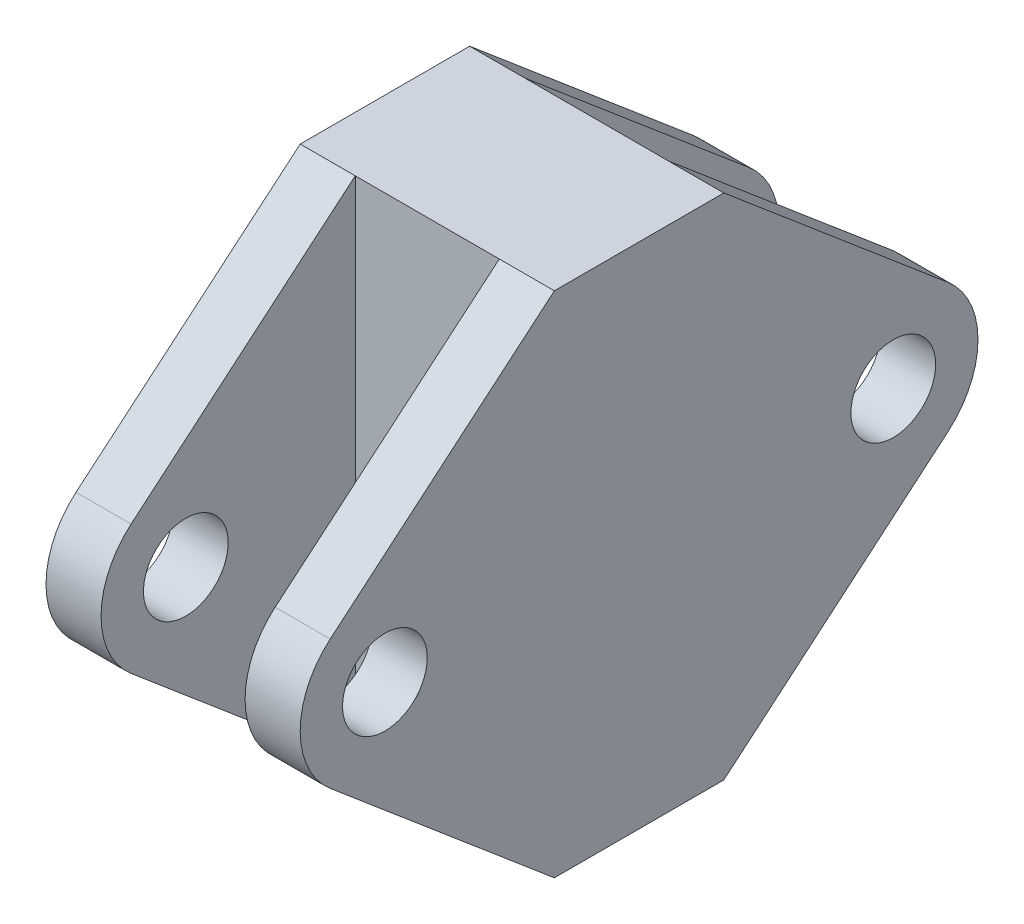
ISO-10303-21;
HEADER;
FILE_DESCRIPTION(('STEP AP214'),'2;1');
FILE_NAME('part.step','',(''),(''),'','','');
FILE_SCHEMA(('AUTOMOTIVE_DESIGN { 1 0 10303 214 1 1 1 1 }'));
ENDSEC;
DATA;
#1=APPLICATION_CONTEXT('core data for automotive mechanical design processes');
#2=APPLICATION_PROTOCOL_DEFINITION('international standard','automotive_design',2000,#1);
#3=PRODUCT_CONTEXT('',#1,'mechanical');
#4=PRODUCT('Part','Part','',(#3));
#5=PRODUCT_RELATED_PRODUCT_CATEGORY('part','',(#4));
#6=PRODUCT_DEFINITION_FORMATION('','',#4);
#7=PRODUCT_DEFINITION_CONTEXT('part definition',#1,'design');
#8=PRODUCT_DEFINITION('design','',#6,#7);
#9=PRODUCT_DEFINITION_SHAPE('','',#8);
#10=(LENGTH_UNIT() NAMED_UNIT(*) SI_UNIT(.MILLI.,.METRE.));
#11=(NAMED_UNIT(*) PLANE_ANGLE_UNIT() SI_UNIT($,.RADIAN.));
#12=(NAMED_UNIT(*) SI_UNIT($,.STERADIAN.) SOLID_ANGLE_UNIT());
#13=UNCERTAINTY_MEASURE_WITH_UNIT(LENGTH_MEASURE(1.E-05),#10,'distance_accuracy_value','');
#14=(GEOMETRIC_REPRESENTATION_CONTEXT(3) GLOBAL_UNCERTAINTY_ASSIGNED_CONTEXT((#13)) GLOBAL_UNIT_ASSIGNED_CONTEXT((#10,
#11,#12)) REPRESENTATION_CONTEXT('',''));
#15=CARTESIAN_POINT('',(0.,0.,0.));
#16=DIRECTION('',(0.,0.,1.));
#17=DIRECTION('',(1.,0.,0.));
#18=AXIS2_PLACEMENT_3D('',#15,#16,#17);
#19=CARTESIAN_POINT('',(15.,30.,10.));
#20=DIRECTION('',(0.,-0.763707940790423,-0.645561911185636));
#21=DIRECTION('',(0.,0.645561911185636,-0.763707940790423));
#22=AXIS2_PLACEMENT_3D('',#19,#20,#21);
#23=PLANE('',#22);
#24=DIRECTION('',(0.,-0.645561911185636,0.763707940790423));
#25=VECTOR('',#24,1.);
#26=CARTESIAN_POINT('',(-8.5,30.,10.));
#27=LINE('',#26,#25);
#28=CARTESIAN_POINT('',(-8.5,30.,10.));
#29=VERTEX_POINT('',#28);
#30=CARTESIAN_POINT('',(-8.5,7.63707940790419,36.4556191118563));
#31=VERTEX_POINT('',#30);
#32=EDGE_CURVE('E169',#29,#31,#27,.T.);
#33=ORIENTED_EDGE('',*,*,#32,.F.);
#34=DIRECTION('',(-1.,0.,0.));
#35=VECTOR('',#34,1.);
#36=CARTESIAN_POINT('',(15.,30.,10.));
#37=LINE('',#36,#35);
#38=CARTESIAN_POINT('',(-15.,30.,10.));
#39=VERTEX_POINT('',#38);
#40=EDGE_CURVE('E177',#29,#39,#37,.T.);
#41=ORIENTED_EDGE('',*,*,#40,.T.);
#42=DIRECTION('',(0.,-0.645561911185636,0.763707940790423));
#43=VECTOR('',#42,1.);
#44=CARTESIAN_POINT('',(-15.,30.,10.));
#45=LINE('',#44,#43);
#46=CARTESIAN_POINT('',(-15.,7.6370794079042,36.4556191118563));
#47=VERTEX_POINT('',#46);
#48=EDGE_CURVE('E259',#39,#47,#45,.T.);
#49=ORIENTED_EDGE('',*,*,#48,.T.);
#50=DIRECTION('',(-1.,0.,0.));
#51=VECTOR('',#50,1.);
#52=CARTESIAN_POINT('',(15.,7.6370794079042,36.4556191118563));
#53=LINE('',#52,#51);
#54=EDGE_CURVE('E50',#31,#47,#53,.T.);
#55=ORIENTED_EDGE('',*,*,#54,.F.);
#56=EDGE_LOOP('',(#33,#41,#49,#55));
#57=FACE_BOUND('',#56,.T.);
#58=ADVANCED_FACE('F41',(#57),#23,.F.);
#59=CARTESIAN_POINT('',(15.,0.,30.));
#60=DIRECTION('',(-1.,0.,0.));
#61=DIRECTION('',(0.,0.,1.));
#62=AXIS2_PLACEMENT_3D('',#59,#60,#61);
#63=CYLINDRICAL_SURFACE('',#62,9.99999999999997);
#64=DIRECTION('',(-1.,0.,0.));
#65=VECTOR('',#64,1.);
#66=CARTESIAN_POINT('',(15.,-7.63707940790422,36.4556191118563));
#67=LINE('',#66,#65);
#68=CARTESIAN_POINT('',(-8.5,-7.63707940790422,36.4556191118563));
#69=VERTEX_POINT('',#68);
#70=CARTESIAN_POINT('',(-15.,-7.63707940790422,36.4556191118563));
#71=VERTEX_POINT('',#70);
#72=EDGE_CURVE('E214',#69,#71,#67,.T.);
#73=ORIENTED_EDGE('',*,*,#72,.F.);
#74=CARTESIAN_POINT('',(-8.5,0.,30.));
#75=DIRECTION('',(1.,0.,0.));
#76=DIRECTION('',(0.,0.,-1.));
#77=AXIS2_PLACEMENT_3D('',#74,#75,#76);
#78=CIRCLE('',#77,9.99999999999997);
#79=EDGE_CURVE('E180',#31,#69,#78,.T.);
#80=ORIENTED_EDGE('',*,*,#79,.F.);
#81=ORIENTED_EDGE('',*,*,#54,.T.);
#82=CARTESIAN_POINT('',(-15.,0.,30.));
#83=DIRECTION('',(1.,0.,0.));
#84=DIRECTION('',(0.,0.,-1.));
#85=AXIS2_PLACEMENT_3D('',#82,#83,#84);
#86=CIRCLE('',#85,9.99999999999997);
#87=EDGE_CURVE('E277',#47,#71,#86,.T.);
#88=ORIENTED_EDGE('',*,*,#87,.T.);
#89=EDGE_LOOP('',(#73,#80,#81,#88));
#90=FACE_BOUND('',#89,.T.);
#91=ADVANCED_FACE('F308',(#90),#63,.T.);
#92=CARTESIAN_POINT('',(15.,-30.,9.99999999999999));
#93=DIRECTION('',(0.,0.763707940790423,-0.645561911185636));
#94=DIRECTION('',(0.,0.645561911185636,0.763707940790423));
#95=AXIS2_PLACEMENT_3D('',#92,#93,#94);
#96=PLANE('',#95);
#97=DIRECTION('',(0.,-0.645561911185636,-0.763707940790423));
#98=VECTOR('',#97,1.);
#99=CARTESIAN_POINT('',(-8.5,-30.,9.99999999999999));
#100=LINE('',#99,#98);
#101=CARTESIAN_POINT('',(-8.5,-30.,10.));
#102=VERTEX_POINT('',#101);
#103=EDGE_CURVE('E172',#69,#102,#100,.T.);
#104=ORIENTED_EDGE('',*,*,#103,.F.);
#105=ORIENTED_EDGE('',*,*,#72,.T.);
#106=DIRECTION('',(0.,-0.645561911185636,-0.763707940790423));
#107=VECTOR('',#106,1.);
#108=CARTESIAN_POINT('',(-15.,-30.,9.99999999999999));
#109=LINE('',#108,#107);
#110=CARTESIAN_POINT('',(-15.,-30.,9.99999999999999));
#111=VERTEX_POINT('',#110);
#112=EDGE_CURVE('E280',#71,#111,#109,.T.);
#113=ORIENTED_EDGE('',*,*,#112,.T.);
#114=DIRECTION('',(-1.,0.,0.));
#115=VECTOR('',#114,1.);
#116=CARTESIAN_POINT('',(15.,-30.,9.99999999999999));
#117=LINE('',#116,#115);
#118=EDGE_CURVE('E210',#102,#111,#117,.T.);
#119=ORIENTED_EDGE('',*,*,#118,.F.);
#120=EDGE_LOOP('',(#104,#105,#113,#119));
#121=FACE_BOUND('',#120,.T.);
#122=ADVANCED_FACE('F364',(#121),#96,.F.);
#123=CARTESIAN_POINT('',(15.,-30.,-10.));
#124=DIRECTION('',(0.,0.763707940790423,0.645561911185636));
#125=DIRECTION('',(0.,-0.645561911185636,0.763707940790423));
#126=AXIS2_PLACEMENT_3D('',#123,#124,#125);
#127=PLANE('',#126);
#128=DIRECTION('',(0.,-0.645561911185636,0.763707940790423));
#129=VECTOR('',#128,1.);
#130=CARTESIAN_POINT('',(8.5,-30.,-10.));
#131=LINE('',#130,#129);
#132=CARTESIAN_POINT('',(8.5,-7.63707940790421,-36.4556191118564));
#133=VERTEX_POINT('',#132);
#134=CARTESIAN_POINT('',(8.5,-30.,-10.));
#135=VERTEX_POINT('',#134);
#136=EDGE_CURVE('E235',#133,#135,#131,.T.);
#137=ORIENTED_EDGE('',*,*,#136,.F.);
#138=DIRECTION('',(-1.,0.,0.));
#139=VECTOR('',#138,1.);
#140=CARTESIAN_POINT('',(15.,-7.63707940790421,-36.4556191118564));
#141=LINE('',#140,#139);
#142=CARTESIAN_POINT('',(15.,-7.63707940790421,-36.4556191118564));
#143=VERTEX_POINT('',#142);
#144=EDGE_CURVE('E203',#143,#133,#141,.T.);
#145=ORIENTED_EDGE('',*,*,#144,.F.);
#146=DIRECTION('',(0.,0.645561911185636,-0.763707940790423));
#147=VECTOR('',#146,1.);
#148=CARTESIAN_POINT('',(15.,-30.,-10.));
#149=LINE('',#148,#147);
#150=CARTESIAN_POINT('',(15.,-30.,-10.));
#151=VERTEX_POINT('',#150);
#152=EDGE_CURVE('E271',#151,#143,#149,.T.);
#153=ORIENTED_EDGE('',*,*,#152,.F.);
#154=DIRECTION('',(-1.,0.,0.));
#155=VECTOR('',#154,1.);
#156=CARTESIAN_POINT('',(15.,-30.,-10.));
#157=LINE('',#156,#155);
#158=EDGE_CURVE('E207',#151,#135,#157,.T.);
#159=ORIENTED_EDGE('',*,*,#158,.T.);
#160=EDGE_LOOP('',(#137,#145,#153,#159));
#161=FACE_BOUND('',#160,.T.);
#162=ADVANCED_FACE('F362',(#161),#127,.F.);
#163=CARTESIAN_POINT('',(15.,0.,-30.));
#164=DIRECTION('',(-1.,0.,0.));
#165=DIRECTION('',(0.,0.,1.));
#166=AXIS2_PLACEMENT_3D('',#163,#164,#165);
#167=CYLINDRICAL_SURFACE('',#166,9.99999999999996);
#168=CARTESIAN_POINT('',(8.5,0.,-30.));
#169=DIRECTION('',(-1.,0.,0.));
#170=DIRECTION('',(0.,0.,1.));
#171=AXIS2_PLACEMENT_3D('',#168,#169,#170);
#172=CIRCLE('',#171,9.99999999999996);
#173=CARTESIAN_POINT('',(8.5,7.63707940790421,-36.4556191118563));
#174=VERTEX_POINT('',#173);
#175=EDGE_CURVE('E230',#174,#133,#172,.T.);
#176=ORIENTED_EDGE('',*,*,#175,.F.);
#177=DIRECTION('',(-1.,0.,0.));
#178=VECTOR('',#177,1.);
#179=CARTESIAN_POINT('',(15.,7.63707940790421,-36.4556191118563));
#180=LINE('',#179,#178);
#181=CARTESIAN_POINT('',(15.,7.63707940790421,-36.4556191118563));
#182=VERTEX_POINT('',#181);
#183=EDGE_CURVE('E199',#182,#174,#180,.T.);
#184=ORIENTED_EDGE('',*,*,#183,.F.);
#185=CARTESIAN_POINT('',(15.,0.,-30.));
#186=DIRECTION('',(1.,0.,0.));
#187=DIRECTION('',(0.,0.,1.));
#188=AXIS2_PLACEMENT_3D('',#185,#186,#187);
#189=CIRCLE('',#188,9.99999999999996);
#190=EDGE_CURVE('E273',#143,#182,#189,.T.);
#191=ORIENTED_EDGE('',*,*,#190,.F.);
#192=ORIENTED_EDGE('',*,*,#144,.T.);
#193=EDGE_LOOP('',(#176,#184,#191,#192));
#194=FACE_BOUND('',#193,.T.);
#195=ADVANCED_FACE('F358',(#194),#167,.T.);
#196=CARTESIAN_POINT('',(15.,30.,-10.));
#197=DIRECTION('',(0.,-0.763707940790423,0.645561911185636));
#198=DIRECTION('',(0.,-0.645561911185636,-0.763707940790423));
#199=AXIS2_PLACEMENT_3D('',#196,#197,#198);
#200=PLANE('',#199);
#201=DIRECTION('',(0.,-0.645561911185636,-0.763707940790423));
#202=VECTOR('',#201,1.);
#203=CARTESIAN_POINT('',(8.5,30.,-10.));
#204=LINE('',#203,#202);
#205=CARTESIAN_POINT('',(8.5,30.,-10.));
#206=VERTEX_POINT('',#205);
#207=EDGE_CURVE('E226',#206,#174,#204,.T.);
#208=ORIENTED_EDGE('',*,*,#207,.F.);
#209=DIRECTION('',(-1.,0.,0.));
#210=VECTOR('',#209,1.);
#211=CARTESIAN_POINT('',(15.,30.,-10.));
#212=LINE('',#211,#210);
#213=CARTESIAN_POINT('',(15.,30.,-10.));
#214=VERTEX_POINT('',#213);
#215=EDGE_CURVE('E195',#214,#206,#212,.T.);
#216=ORIENTED_EDGE('',*,*,#215,.F.);
#217=DIRECTION('',(0.,0.645561911185636,0.763707940790423));
#218=VECTOR('',#217,1.);
#219=CARTESIAN_POINT('',(15.,30.,-10.));
#220=LINE('',#219,#218);
#221=EDGE_CURVE('E190',#182,#214,#220,.T.);
#222=ORIENTED_EDGE('',*,*,#221,.F.);
#223=ORIENTED_EDGE('',*,*,#183,.T.);
#224=EDGE_LOOP('',(#208,#216,#222,#223));
#225=FACE_BOUND('',#224,.T.);
#226=ADVANCED_FACE('F356',(#225),#200,.F.);
#227=CARTESIAN_POINT('',(15.,0.,-30.));
#228=DIRECTION('',(-1.,0.,0.));
#229=DIRECTION('',(0.,0.,1.));
#230=AXIS2_PLACEMENT_3D('',#227,#228,#229);
#231=CYLINDRICAL_SURFACE('',#230,5.);
#232=CARTESIAN_POINT('',(15.,0.,-30.));
#233=DIRECTION('',(1.,0.,0.));
#234=DIRECTION('',(0.,0.,1.));
#235=AXIS2_PLACEMENT_3D('',#232,#233,#234);
#236=CIRCLE('',#235,5.);
#237=CARTESIAN_POINT('',(15.,0.,-25.));
#238=VERTEX_POINT('',#237);
#239=EDGE_CURVE('E256',#238,#238,#236,.T.);
#240=ORIENTED_EDGE('',*,*,#239,.T.);
#241=EDGE_LOOP('',(#240));
#242=FACE_BOUND('',#241,.T.);
#243=CARTESIAN_POINT('',(8.5,0.,-30.));
#244=DIRECTION('',(-1.,0.,0.));
#245=DIRECTION('',(0.,0.,1.));
#246=AXIS2_PLACEMENT_3D('',#243,#244,#245);
#247=CIRCLE('',#246,5.);
#248=CARTESIAN_POINT('',(8.5,0.,-25.));
#249=VERTEX_POINT('',#248);
#250=EDGE_CURVE('E179',#249,#249,#247,.T.);
#251=ORIENTED_EDGE('',*,*,#250,.T.);
#252=EDGE_LOOP('',(#251));
#253=FACE_BOUND('',#252,.T.);
#254=ADVANCED_FACE('F428',(#242,#253),#231,.F.);
#255=CARTESIAN_POINT('',(15.,0.,30.));
#256=DIRECTION('',(-1.,0.,0.));
#257=DIRECTION('',(0.,0.,1.));
#258=AXIS2_PLACEMENT_3D('',#255,#256,#257);
#259=CYLINDRICAL_SURFACE('',#258,5.);
#260=CARTESIAN_POINT('',(-15.,0.,30.));
#261=DIRECTION('',(1.,0.,0.));
#262=DIRECTION('',(0.,0.,-1.));
#263=AXIS2_PLACEMENT_3D('',#260,#261,#262);
#264=CIRCLE('',#263,5.);
#265=CARTESIAN_POINT('',(-15.,0.,25.));
#266=VERTEX_POINT('',#265);
#267=EDGE_CURVE('E249',#266,#266,#264,.T.);
#268=ORIENTED_EDGE('',*,*,#267,.F.);
#269=EDGE_LOOP('',(#268));
#270=FACE_BOUND('',#269,.T.);
#271=CARTESIAN_POINT('',(-8.5,0.,30.));
#272=DIRECTION('',(1.,0.,0.));
#273=DIRECTION('',(0.,0.,-1.));
#274=AXIS2_PLACEMENT_3D('',#271,#272,#273);
#275=CIRCLE('',#274,5.);
#276=CARTESIAN_POINT('',(-8.5,0.,25.));
#277=VERTEX_POINT('',#276);
#278=EDGE_CURVE('E222',#277,#277,#275,.T.);
#279=ORIENTED_EDGE('',*,*,#278,.T.);
#280=EDGE_LOOP('',(#279));
#281=FACE_BOUND('',#280,.T.);
#282=ADVANCED_FACE('F391',(#270,#281),#259,.F.);
#283=CARTESIAN_POINT('',(15.,0.,30.));
#284=DIRECTION('',(1.,0.,0.));
#285=DIRECTION('',(0.,0.,-1.));
#286=AXIS2_PLACEMENT_3D('',#283,#284,#285);
#287=PLANE('',#286);
#288=ORIENTED_EDGE('',*,*,#239,.F.);
#289=EDGE_LOOP('',(#288));
#290=FACE_BOUND('',#289,.T.);
#291=DIRECTION('',(0.,-0.645561911185636,0.763707940790423));
#292=VECTOR('',#291,1.);
#293=CARTESIAN_POINT('',(15.,30.,10.));
#294=LINE('',#293,#292);
#295=CARTESIAN_POINT('',(15.,30.,10.));
#296=VERTEX_POINT('',#295);
#297=CARTESIAN_POINT('',(15.,7.6370794079042,36.4556191118563));
#298=VERTEX_POINT('',#297);
#299=EDGE_CURVE('E262',#296,#298,#294,.T.);
#300=ORIENTED_EDGE('',*,*,#299,.T.);
#301=CARTESIAN_POINT('',(15.,0.,30.));
#302=DIRECTION('',(1.,0.,0.));
#303=DIRECTION('',(0.,0.,-1.));
#304=AXIS2_PLACEMENT_3D('',#301,#302,#303);
#305=CIRCLE('',#304,9.99999999999997);
#306=CARTESIAN_POINT('',(15.,-7.63707940790422,36.4556191118563));
#307=VERTEX_POINT('',#306);
#308=EDGE_CURVE('E265',#298,#307,#305,.T.);
#309=ORIENTED_EDGE('',*,*,#308,.T.);
#310=DIRECTION('',(0.,-0.645561911185636,-0.763707940790423));
#311=VECTOR('',#310,1.);
#312=CARTESIAN_POINT('',(15.,-30.,9.99999999999999));
#313=LINE('',#312,#311);
#314=CARTESIAN_POINT('',(15.,-30.,9.99999999999999));
#315=VERTEX_POINT('',#314);
#316=EDGE_CURVE('E267',#307,#315,#313,.T.);
#317=ORIENTED_EDGE('',*,*,#316,.T.);
#318=DIRECTION('',(0.,0.,-1.));
#319=VECTOR('',#318,1.);
#320=CARTESIAN_POINT('',(15.,-30.,9.99999999999999));
#321=LINE('',#320,#319);
#322=EDGE_CURVE('E269',#315,#151,#321,.T.);
#323=ORIENTED_EDGE('',*,*,#322,.T.);
#324=ORIENTED_EDGE('',*,*,#152,.T.);
#325=ORIENTED_EDGE('',*,*,#190,.T.);
#326=ORIENTED_EDGE('',*,*,#221,.T.);
#327=DIRECTION('',(0.,0.,1.));
#328=VECTOR('',#327,1.);
#329=CARTESIAN_POINT('',(15.,30.,10.));
#330=LINE('',#329,#328);
#331=EDGE_CURVE('E187',#214,#296,#330,.T.);
#332=ORIENTED_EDGE('',*,*,#331,.T.);
#333=EDGE_LOOP('',(#300,#309,#317,#323,#324,#325,#326,#332));
#334=FACE_BOUND('',#333,.T.);
#335=CARTESIAN_POINT('',(15.,0.,30.));
#336=DIRECTION('',(1.,0.,0.));
#337=DIRECTION('',(0.,0.,-1.));
#338=AXIS2_PLACEMENT_3D('',#335,#336,#337);
#339=CIRCLE('',#338,5.);
#340=CARTESIAN_POINT('',(15.,0.,25.));
#341=VERTEX_POINT('',#340);
#342=EDGE_CURVE('E250',#341,#341,#339,.T.);
#343=ORIENTED_EDGE('',*,*,#342,.F.);
#344=EDGE_LOOP('',(#343));
#345=FACE_BOUND('',#344,.T.);
#346=ADVANCED_FACE('F342',(#290,#334,#345),#287,.T.);
#347=CARTESIAN_POINT('',(-15.,0.,30.));
#348=DIRECTION('',(1.,0.,0.));
#349=DIRECTION('',(0.,0.,-1.));
#350=AXIS2_PLACEMENT_3D('',#347,#348,#349);
#351=PLANE('',#350);
#352=ORIENTED_EDGE('',*,*,#48,.F.);
#353=DIRECTION('',(0.,0.,1.));
#354=VECTOR('',#353,1.);
#355=CARTESIAN_POINT('',(-15.,30.,10.));
#356=LINE('',#355,#354);
#357=CARTESIAN_POINT('',(-15.,30.,-10.));
#358=VERTEX_POINT('',#357);
#359=EDGE_CURVE('E184',#358,#39,#356,.T.);
#360=ORIENTED_EDGE('',*,*,#359,.F.);
#361=DIRECTION('',(0.,0.645561911185636,0.763707940790423));
#362=VECTOR('',#361,1.);
#363=CARTESIAN_POINT('',(-15.,30.,-10.));
#364=LINE('',#363,#362);
#365=CARTESIAN_POINT('',(-15.,7.63707940790421,-36.4556191118563));
#366=VERTEX_POINT('',#365);
#367=EDGE_CURVE('E291',#366,#358,#364,.T.);
#368=ORIENTED_EDGE('',*,*,#367,.F.);
#369=CARTESIAN_POINT('',(-15.,0.,-30.));
#370=DIRECTION('',(1.,0.,0.));
#371=DIRECTION('',(0.,0.,1.));
#372=AXIS2_PLACEMENT_3D('',#369,#370,#371);
#373=CIRCLE('',#372,9.99999999999996);
#374=CARTESIAN_POINT('',(-15.,-7.63707940790421,-36.4556191118564));
#375=VERTEX_POINT('',#374);
#376=EDGE_CURVE('E289',#375,#366,#373,.T.);
#377=ORIENTED_EDGE('',*,*,#376,.F.);
#378=DIRECTION('',(0.,0.645561911185636,-0.763707940790423));
#379=VECTOR('',#378,1.);
#380=CARTESIAN_POINT('',(-15.,-30.,-10.));
#381=LINE('',#380,#379);
#382=CARTESIAN_POINT('',(-15.,-30.,-10.));
#383=VERTEX_POINT('',#382);
#384=EDGE_CURVE('E286',#383,#375,#381,.T.);
#385=ORIENTED_EDGE('',*,*,#384,.F.);
#386=DIRECTION('',(0.,0.,-1.));
#387=VECTOR('',#386,1.);
#388=CARTESIAN_POINT('',(-15.,-30.,9.99999999999999));
#389=LINE('',#388,#387);
#390=EDGE_CURVE('E283',#111,#383,#389,.T.);
#391=ORIENTED_EDGE('',*,*,#390,.F.);
#392=ORIENTED_EDGE('',*,*,#112,.F.);
#393=ORIENTED_EDGE('',*,*,#87,.F.);
#394=EDGE_LOOP('',(#352,#360,#368,#377,#385,#391,#392,#393));
#395=FACE_BOUND('',#394,.T.);
#396=CARTESIAN_POINT('',(-15.,0.,-30.));
#397=DIRECTION('',(1.,0.,0.));
#398=DIRECTION('',(0.,0.,1.));
#399=AXIS2_PLACEMENT_3D('',#396,#397,#398);
#400=CIRCLE('',#399,5.);
#401=CARTESIAN_POINT('',(-15.,0.,-25.));
#402=VERTEX_POINT('',#401);
#403=EDGE_CURVE('E253',#402,#402,#400,.T.);
#404=ORIENTED_EDGE('',*,*,#403,.T.);
#405=EDGE_LOOP('',(#404));
#406=FACE_BOUND('',#405,.T.);
#407=ORIENTED_EDGE('',*,*,#267,.T.);
#408=EDGE_LOOP('',(#407));
#409=FACE_BOUND('',#408,.T.);
#410=ADVANCED_FACE('F301',(#395,#406,#409),#351,.F.);
#411=CARTESIAN_POINT('',(8.5,30.,10.));
#412=VERTEX_POINT('',#411);
#413=EDGE_CURVE('E186',#296,#412,#37,.T.);
#414=ORIENTED_EDGE('',*,*,#413,.T.);
#415=DIRECTION('',(0.,-0.645561911185636,0.763707940790423));
#416=VECTOR('',#415,1.);
#417=CARTESIAN_POINT('',(8.5,30.,10.));
#418=LINE('',#417,#416);
#419=CARTESIAN_POINT('',(8.5,7.63707940790419,36.4556191118563));
#420=VERTEX_POINT('',#419);
#421=EDGE_CURVE('E224',#412,#420,#418,.T.);
#422=ORIENTED_EDGE('',*,*,#421,.T.);
#423=EDGE_CURVE('E11',#298,#420,#53,.T.);
#424=ORIENTED_EDGE('',*,*,#423,.F.);
#425=ORIENTED_EDGE('',*,*,#299,.F.);
#426=EDGE_LOOP('',(#414,#422,#424,#425));
#427=FACE_BOUND('',#426,.T.);
#428=ADVANCED_FACE('F43',(#427),#23,.F.);
#429=CARTESIAN_POINT('',(8.5,0.,30.));
#430=DIRECTION('',(1.,0.,0.));
#431=DIRECTION('',(0.,0.,-1.));
#432=AXIS2_PLACEMENT_3D('',#429,#430,#431);
#433=CIRCLE('',#432,9.99999999999997);
#434=CARTESIAN_POINT('',(8.5,-7.63707940790422,36.4556191118563));
#435=VERTEX_POINT('',#434);
#436=EDGE_CURVE('E313',#420,#435,#433,.T.);
#437=ORIENTED_EDGE('',*,*,#436,.T.);
#438=EDGE_CURVE('E215',#307,#435,#67,.T.);
#439=ORIENTED_EDGE('',*,*,#438,.F.);
#440=ORIENTED_EDGE('',*,*,#308,.F.);
#441=ORIENTED_EDGE('',*,*,#423,.T.);
#442=EDGE_LOOP('',(#437,#439,#440,#441));
#443=FACE_BOUND('',#442,.T.);
#444=ADVANCED_FACE('F348',(#443),#63,.T.);
#445=ORIENTED_EDGE('',*,*,#438,.T.);
#446=DIRECTION('',(0.,-0.645561911185636,-0.763707940790423));
#447=VECTOR('',#446,1.);
#448=CARTESIAN_POINT('',(8.5,-30.,9.99999999999999));
#449=LINE('',#448,#447);
#450=CARTESIAN_POINT('',(8.5,-30.,10.));
#451=VERTEX_POINT('',#450);
#452=EDGE_CURVE('E221',#435,#451,#449,.T.);
#453=ORIENTED_EDGE('',*,*,#452,.T.);
#454=EDGE_CURVE('E211',#315,#451,#117,.T.);
#455=ORIENTED_EDGE('',*,*,#454,.F.);
#456=ORIENTED_EDGE('',*,*,#316,.F.);
#457=EDGE_LOOP('',(#445,#453,#455,#456));
#458=FACE_BOUND('',#457,.T.);
#459=ADVANCED_FACE('F334',(#458),#96,.F.);
#460=CARTESIAN_POINT('',(15.,-30.,9.99999999999999));
#461=DIRECTION('',(0.,1.,0.));
#462=DIRECTION('',(0.,0.,1.));
#463=AXIS2_PLACEMENT_3D('',#460,#461,#462);
#464=PLANE('',#463);
#465=ORIENTED_EDGE('',*,*,#390,.T.);
#466=CARTESIAN_POINT('',(-8.5,-30.,-10.));
#467=VERTEX_POINT('',#466);
#468=EDGE_CURVE('E206',#467,#383,#157,.T.);
#469=ORIENTED_EDGE('',*,*,#468,.F.);
#470=DIRECTION('',(1.,0.,0.));
#471=VECTOR('',#470,1.);
#472=CARTESIAN_POINT('',(-8.5,-30.,-10.));
#473=LINE('',#472,#471);
#474=EDGE_CURVE('E322',#467,#135,#473,.T.);
#475=ORIENTED_EDGE('',*,*,#474,.T.);
#476=ORIENTED_EDGE('',*,*,#158,.F.);
#477=ORIENTED_EDGE('',*,*,#322,.F.);
#478=ORIENTED_EDGE('',*,*,#454,.T.);
#479=DIRECTION('',(1.,0.,0.));
#480=VECTOR('',#479,1.);
#481=CARTESIAN_POINT('',(-8.5,-30.,10.));
#482=LINE('',#481,#480);
#483=EDGE_CURVE('E164',#102,#451,#482,.T.);
#484=ORIENTED_EDGE('',*,*,#483,.F.);
#485=ORIENTED_EDGE('',*,*,#118,.T.);
#486=EDGE_LOOP('',(#465,#469,#475,#476,#477,#478,#484,#485));
#487=FACE_BOUND('',#486,.T.);
#488=ADVANCED_FACE('F338',(#487),#464,.F.);
#489=CARTESIAN_POINT('',(-8.5,-7.63707940790421,-36.4556191118564));
#490=VERTEX_POINT('',#489);
#491=EDGE_CURVE('E202',#490,#375,#141,.T.);
#492=ORIENTED_EDGE('',*,*,#491,.F.);
#493=DIRECTION('',(0.,-0.645561911185636,0.763707940790423));
#494=VECTOR('',#493,1.);
#495=CARTESIAN_POINT('',(-8.5,-30.,-10.));
#496=LINE('',#495,#494);
#497=EDGE_CURVE('E246',#490,#467,#496,.T.);
#498=ORIENTED_EDGE('',*,*,#497,.T.);
#499=ORIENTED_EDGE('',*,*,#468,.T.);
#500=ORIENTED_EDGE('',*,*,#384,.T.);
#501=EDGE_LOOP('',(#492,#498,#499,#500));
#502=FACE_BOUND('',#501,.T.);
#503=ADVANCED_FACE('F366',(#502),#127,.F.);
#504=CARTESIAN_POINT('',(-8.5,7.63707940790421,-36.4556191118563));
#505=VERTEX_POINT('',#504);
#506=EDGE_CURVE('E198',#505,#366,#180,.T.);
#507=ORIENTED_EDGE('',*,*,#506,.F.);
#508=CARTESIAN_POINT('',(-8.5,0.,-30.));
#509=DIRECTION('',(-1.,0.,0.));
#510=DIRECTION('',(0.,0.,1.));
#511=AXIS2_PLACEMENT_3D('',#508,#509,#510);
#512=CIRCLE('',#511,9.99999999999996);
#513=EDGE_CURVE('E243',#505,#490,#512,.T.);
#514=ORIENTED_EDGE('',*,*,#513,.T.);
#515=ORIENTED_EDGE('',*,*,#491,.T.);
#516=ORIENTED_EDGE('',*,*,#376,.T.);
#517=EDGE_LOOP('',(#507,#514,#515,#516));
#518=FACE_BOUND('',#517,.T.);
#519=ADVANCED_FACE('F372',(#518),#167,.T.);
#520=CARTESIAN_POINT('',(-8.5,30.,-10.));
#521=VERTEX_POINT('',#520);
#522=EDGE_CURVE('E189',#521,#358,#212,.T.);
#523=ORIENTED_EDGE('',*,*,#522,.F.);
#524=DIRECTION('',(0.,-0.645561911185636,-0.763707940790423));
#525=VECTOR('',#524,1.);
#526=CARTESIAN_POINT('',(-8.5,30.,-10.));
#527=LINE('',#526,#525);
#528=EDGE_CURVE('E240',#521,#505,#527,.T.);
#529=ORIENTED_EDGE('',*,*,#528,.T.);
#530=ORIENTED_EDGE('',*,*,#506,.T.);
#531=ORIENTED_EDGE('',*,*,#367,.T.);
#532=EDGE_LOOP('',(#523,#529,#530,#531));
#533=FACE_BOUND('',#532,.T.);
#534=ADVANCED_FACE('F296',(#533),#200,.F.);
#535=CARTESIAN_POINT('',(15.,30.,10.));
#536=DIRECTION('',(0.,-1.,0.));
#537=DIRECTION('',(0.,0.,-1.));
#538=AXIS2_PLACEMENT_3D('',#535,#536,#537);
#539=PLANE('',#538);
#540=ORIENTED_EDGE('',*,*,#359,.T.);
#541=ORIENTED_EDGE('',*,*,#40,.F.);
#542=DIRECTION('',(1.,0.,0.));
#543=VECTOR('',#542,1.);
#544=CARTESIAN_POINT('',(-8.5,30.,10.));
#545=LINE('',#544,#543);
#546=EDGE_CURVE('E155',#29,#412,#545,.T.);
#547=ORIENTED_EDGE('',*,*,#546,.T.);
#548=ORIENTED_EDGE('',*,*,#413,.F.);
#549=ORIENTED_EDGE('',*,*,#331,.F.);
#550=ORIENTED_EDGE('',*,*,#215,.T.);
#551=DIRECTION('',(1.,0.,0.));
#552=VECTOR('',#551,1.);
#553=CARTESIAN_POINT('',(-8.5,30.,-10.));
#554=LINE('',#553,#552);
#555=EDGE_CURVE('E319',#521,#206,#554,.T.);
#556=ORIENTED_EDGE('',*,*,#555,.F.);
#557=ORIENTED_EDGE('',*,*,#522,.T.);
#558=EDGE_LOOP('',(#540,#541,#547,#548,#549,#550,#556,#557));
#559=FACE_BOUND('',#558,.T.);
#560=ADVANCED_FACE('F182',(#559),#539,.F.);
#561=CARTESIAN_POINT('',(-8.5,0.,-30.));
#562=DIRECTION('',(-1.,0.,0.));
#563=DIRECTION('',(0.,0.,1.));
#564=AXIS2_PLACEMENT_3D('',#561,#562,#563);
#565=CIRCLE('',#564,5.);
#566=CARTESIAN_POINT('',(-8.5,0.,-25.));
#567=VERTEX_POINT('',#566);
#568=EDGE_CURVE('E45',#567,#567,#565,.T.);
#569=ORIENTED_EDGE('',*,*,#568,.F.);
#570=EDGE_LOOP('',(#569));
#571=FACE_BOUND('',#570,.T.);
#572=ORIENTED_EDGE('',*,*,#403,.F.);
#573=EDGE_LOOP('',(#572));
#574=FACE_BOUND('',#573,.T.);
#575=ADVANCED_FACE('F398',(#571,#574),#231,.F.);
#576=CARTESIAN_POINT('',(8.5,0.,30.));
#577=DIRECTION('',(1.,0.,0.));
#578=DIRECTION('',(0.,0.,-1.));
#579=AXIS2_PLACEMENT_3D('',#576,#577,#578);
#580=CIRCLE('',#579,5.);
#581=CARTESIAN_POINT('',(8.5,0.,25.));
#582=VERTEX_POINT('',#581);
#583=EDGE_CURVE('E218',#582,#582,#580,.T.);
#584=ORIENTED_EDGE('',*,*,#583,.F.);
#585=EDGE_LOOP('',(#584));
#586=FACE_BOUND('',#585,.T.);
#587=ORIENTED_EDGE('',*,*,#342,.T.);
#588=EDGE_LOOP('',(#587));
#589=FACE_BOUND('',#588,.T.);
#590=ADVANCED_FACE('F423',(#586,#589),#259,.F.);
#591=CARTESIAN_POINT('',(-8.5,0.,0.));
#592=DIRECTION('',(1.,0.,0.));
#593=DIRECTION('',(0.,0.,-1.));
#594=AXIS2_PLACEMENT_3D('',#591,#592,#593);
#595=PLANE('',#594);
#596=ORIENTED_EDGE('',*,*,#278,.F.);
#597=EDGE_LOOP('',(#596));
#598=FACE_BOUND('',#597,.T.);
#599=ORIENTED_EDGE('',*,*,#32,.T.);
#600=ORIENTED_EDGE('',*,*,#79,.T.);
#601=ORIENTED_EDGE('',*,*,#103,.T.);
#602=DIRECTION('',(0.,1.,0.));
#603=VECTOR('',#602,1.);
#604=CARTESIAN_POINT('',(-8.5,-30.,10.));
#605=LINE('',#604,#603);
#606=EDGE_CURVE('E158',#102,#29,#605,.T.);
#607=ORIENTED_EDGE('',*,*,#606,.T.);
#608=EDGE_LOOP('',(#599,#600,#601,#607));
#609=FACE_BOUND('',#608,.T.);
#610=ADVANCED_FACE('F168',(#598,#609),#595,.T.);
#611=CARTESIAN_POINT('',(8.5,0.,0.));
#612=DIRECTION('',(1.,0.,0.));
#613=DIRECTION('',(0.,0.,-1.));
#614=AXIS2_PLACEMENT_3D('',#611,#612,#613);
#615=PLANE('',#614);
#616=ORIENTED_EDGE('',*,*,#583,.T.);
#617=EDGE_LOOP('',(#616));
#618=FACE_BOUND('',#617,.T.);
#619=DIRECTION('',(0.,1.,0.));
#620=VECTOR('',#619,1.);
#621=CARTESIAN_POINT('',(8.5,-30.,10.));
#622=LINE('',#621,#620);
#623=EDGE_CURVE('E66',#451,#412,#622,.T.);
#624=ORIENTED_EDGE('',*,*,#623,.F.);
#625=ORIENTED_EDGE('',*,*,#452,.F.);
#626=ORIENTED_EDGE('',*,*,#436,.F.);
#627=ORIENTED_EDGE('',*,*,#421,.F.);
#628=EDGE_LOOP('',(#624,#625,#626,#627));
#629=FACE_BOUND('',#628,.T.);
#630=ADVANCED_FACE('F331',(#618,#629),#615,.F.);
#631=CARTESIAN_POINT('',(-8.5,-30.,10.));
#632=DIRECTION('',(0.,0.,-1.));
#633=DIRECTION('',(-1.,0.,0.));
#634=AXIS2_PLACEMENT_3D('',#631,#632,#633);
#635=PLANE('',#634);
#636=ORIENTED_EDGE('',*,*,#623,.T.);
#637=ORIENTED_EDGE('',*,*,#546,.F.);
#638=ORIENTED_EDGE('',*,*,#606,.F.);
#639=ORIENTED_EDGE('',*,*,#483,.T.);
#640=EDGE_LOOP('',(#636,#637,#638,#639));
#641=FACE_BOUND('',#640,.T.);
#642=ADVANCED_FACE('F157',(#641),#635,.F.);
#643=CARTESIAN_POINT('',(-8.5,0.,0.));
#644=DIRECTION('',(-1.,0.,0.));
#645=DIRECTION('',(0.,0.,1.));
#646=AXIS2_PLACEMENT_3D('',#643,#644,#645);
#647=PLANE('',#646);
#648=ORIENTED_EDGE('',*,*,#568,.T.);
#649=EDGE_LOOP('',(#648));
#650=FACE_BOUND('',#649,.T.);
#651=ORIENTED_EDGE('',*,*,#513,.F.);
#652=ORIENTED_EDGE('',*,*,#528,.F.);
#653=DIRECTION('',(0.,-1.,0.));
#654=VECTOR('',#653,1.);
#655=CARTESIAN_POINT('',(-8.5,-30.,-10.));
#656=LINE('',#655,#654);
#657=EDGE_CURVE('E58',#521,#467,#656,.T.);
#658=ORIENTED_EDGE('',*,*,#657,.T.);
#659=ORIENTED_EDGE('',*,*,#497,.F.);
#660=EDGE_LOOP('',(#651,#652,#658,#659));
#661=FACE_BOUND('',#660,.T.);
#662=ADVANCED_FACE('F409',(#650,#661),#647,.F.);
#663=CARTESIAN_POINT('',(8.5,0.,0.));
#664=DIRECTION('',(-1.,0.,0.));
#665=DIRECTION('',(0.,0.,1.));
#666=AXIS2_PLACEMENT_3D('',#663,#664,#665);
#667=PLANE('',#666);
#668=ORIENTED_EDGE('',*,*,#250,.F.);
#669=EDGE_LOOP('',(#668));
#670=FACE_BOUND('',#669,.T.);
#671=ORIENTED_EDGE('',*,*,#136,.T.);
#672=DIRECTION('',(0.,-1.,0.));
#673=VECTOR('',#672,1.);
#674=CARTESIAN_POINT('',(8.5,-30.,-10.));
#675=LINE('',#674,#673);
#676=EDGE_CURVE('E318',#206,#135,#675,.T.);
#677=ORIENTED_EDGE('',*,*,#676,.F.);
#678=ORIENTED_EDGE('',*,*,#207,.T.);
#679=ORIENTED_EDGE('',*,*,#175,.T.);
#680=EDGE_LOOP('',(#671,#677,#678,#679));
#681=FACE_BOUND('',#680,.T.);
#682=ADVANCED_FACE('F360',(#670,#681),#667,.T.);
#683=CARTESIAN_POINT('',(-8.5,-30.,-10.));
#684=DIRECTION('',(0.,0.,1.));
#685=DIRECTION('',(0.,-1.,0.));
#686=AXIS2_PLACEMENT_3D('',#683,#684,#685);
#687=PLANE('',#686);
#688=ORIENTED_EDGE('',*,*,#676,.T.);
#689=ORIENTED_EDGE('',*,*,#474,.F.);
#690=ORIENTED_EDGE('',*,*,#657,.F.);
#691=ORIENTED_EDGE('',*,*,#555,.T.);
#692=EDGE_LOOP('',(#688,#689,#690,#691));
#693=FACE_BOUND('',#692,.T.);
#694=ADVANCED_FACE('F407',(#693),#687,.F.);
#695=CLOSED_SHELL('',(#58,#91,#122,#162,#195,#226,#254,#282,#346,#410,#428,#444,#459,#488,#503,
#519,#534,#560,#575,#590,#610,#630,#642,#662,#682,#694));
#696=MANIFOLD_SOLID_BREP('B2',#695);
#697=ADVANCED_BREP_SHAPE_REPRESENTATION('',(#18,#696),#14);
#698=SHAPE_DEFINITION_REPRESENTATION(#9,#697);
ENDSEC;
END-ISO-10303-21;
